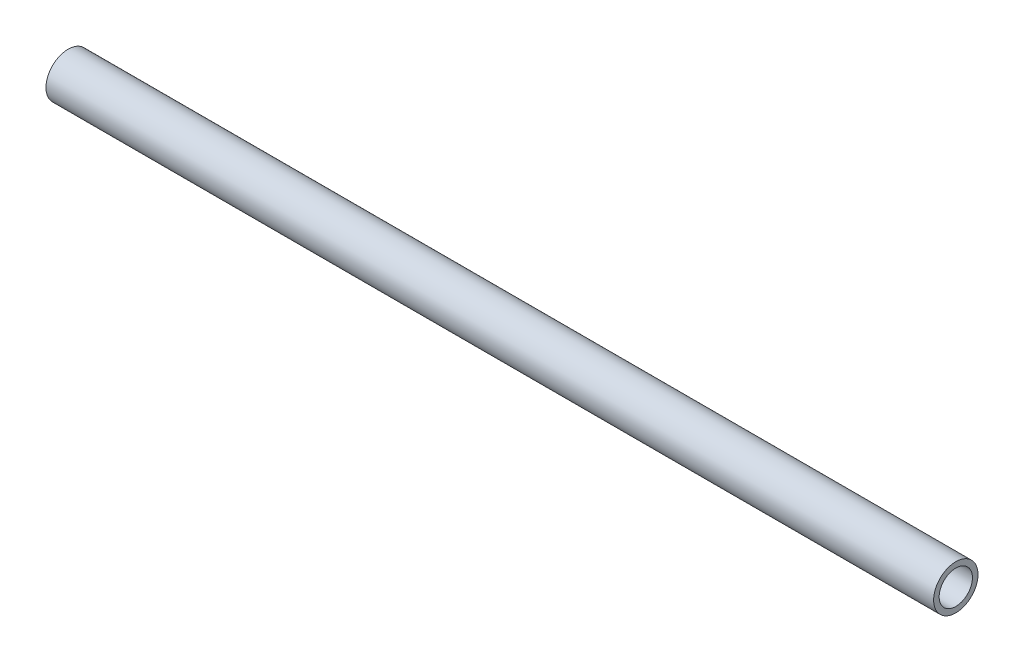
ISO-10303-21;
HEADER;
FILE_DESCRIPTION(('STEP AP214'),'2;1');
FILE_NAME('part.step','',(''),(''),'','','');
FILE_SCHEMA(('AUTOMOTIVE_DESIGN { 1 0 10303 214 1 1 1 1 }'));
ENDSEC;
DATA;
#1=APPLICATION_CONTEXT('core data for automotive mechanical design processes');
#2=APPLICATION_PROTOCOL_DEFINITION('international standard','automotive_design',2000,#1);
#3=PRODUCT_CONTEXT('',#1,'mechanical');
#4=PRODUCT('Part','Part','',(#3));
#5=PRODUCT_RELATED_PRODUCT_CATEGORY('part','',(#4));
#6=PRODUCT_DEFINITION_FORMATION('','',#4);
#7=PRODUCT_DEFINITION_CONTEXT('part definition',#1,'design');
#8=PRODUCT_DEFINITION('design','',#6,#7);
#9=PRODUCT_DEFINITION_SHAPE('','',#8);
#10=(LENGTH_UNIT() NAMED_UNIT(*) SI_UNIT(.MILLI.,.METRE.));
#11=(NAMED_UNIT(*) PLANE_ANGLE_UNIT() SI_UNIT($,.RADIAN.));
#12=(NAMED_UNIT(*) SI_UNIT($,.STERADIAN.) SOLID_ANGLE_UNIT());
#13=UNCERTAINTY_MEASURE_WITH_UNIT(LENGTH_MEASURE(1.E-05),#10,'distance_accuracy_value','');
#14=(GEOMETRIC_REPRESENTATION_CONTEXT(3) GLOBAL_UNCERTAINTY_ASSIGNED_CONTEXT((#13)) GLOBAL_UNIT_ASSIGNED_CONTEXT((#10,
#11,#12)) REPRESENTATION_CONTEXT('',''));
#15=CARTESIAN_POINT('',(0.,0.,0.));
#16=DIRECTION('',(0.,0.,1.));
#17=DIRECTION('',(1.,0.,0.));
#18=AXIS2_PLACEMENT_3D('',#15,#16,#17);
#19=CARTESIAN_POINT('',(127.,0.,0.));
#20=DIRECTION('',(1.,0.,0.));
#21=DIRECTION('',(0.,0.,-1.));
#22=AXIS2_PLACEMENT_3D('',#19,#20,#21);
#23=PLANE('',#22);
#24=CARTESIAN_POINT('',(127.,0.,0.));
#25=DIRECTION('',(1.,0.,0.));
#26=DIRECTION('',(0.,0.,-1.));
#27=AXIS2_PLACEMENT_3D('',#24,#25,#26);
#28=CIRCLE('',#27,6.35);
#29=CARTESIAN_POINT('',(127.,0.,-6.35));
#30=VERTEX_POINT('',#29);
#31=EDGE_CURVE('E10',#30,#30,#28,.T.);
#32=ORIENTED_EDGE('',*,*,#31,.T.);
#33=EDGE_LOOP('',(#32));
#34=FACE_BOUND('',#33,.T.);
#35=CARTESIAN_POINT('',(127.,0.,0.));
#36=DIRECTION('',(1.,0.,0.));
#37=DIRECTION('',(0.,0.,-1.));
#38=AXIS2_PLACEMENT_3D('',#35,#36,#37);
#39=CIRCLE('',#38,4.7625);
#40=CARTESIAN_POINT('',(127.,0.,-4.7625));
#41=VERTEX_POINT('',#40);
#42=EDGE_CURVE('E41',#41,#41,#39,.T.);
#43=ORIENTED_EDGE('',*,*,#42,.F.);
#44=EDGE_LOOP('',(#43));
#45=FACE_BOUND('',#44,.T.);
#46=ADVANCED_FACE('F30',(#34,#45),#23,.T.);
#47=CARTESIAN_POINT('',(-127.,0.,0.));
#48=DIRECTION('',(1.,0.,0.));
#49=DIRECTION('',(0.,0.,-1.));
#50=AXIS2_PLACEMENT_3D('',#47,#48,#49);
#51=PLANE('',#50);
#52=CARTESIAN_POINT('',(-127.,0.,0.));
#53=DIRECTION('',(1.,0.,0.));
#54=DIRECTION('',(0.,0.,-1.));
#55=AXIS2_PLACEMENT_3D('',#52,#53,#54);
#56=CIRCLE('',#55,6.35);
#57=CARTESIAN_POINT('',(-127.,0.,-6.35));
#58=VERTEX_POINT('',#57);
#59=EDGE_CURVE('E34',#58,#58,#56,.T.);
#60=ORIENTED_EDGE('',*,*,#59,.F.);
#61=EDGE_LOOP('',(#60));
#62=FACE_BOUND('',#61,.T.);
#63=CARTESIAN_POINT('',(-127.,0.,0.));
#64=DIRECTION('',(1.,0.,0.));
#65=DIRECTION('',(0.,0.,-1.));
#66=AXIS2_PLACEMENT_3D('',#63,#64,#65);
#67=CIRCLE('',#66,4.7625);
#68=CARTESIAN_POINT('',(-127.,0.,-4.7625));
#69=VERTEX_POINT('',#68);
#70=EDGE_CURVE('E43',#69,#69,#67,.T.);
#71=ORIENTED_EDGE('',*,*,#70,.T.);
#72=EDGE_LOOP('',(#71));
#73=FACE_BOUND('',#72,.T.);
#74=ADVANCED_FACE('F53',(#62,#73),#51,.F.);
#75=CARTESIAN_POINT('',(127.,0.,0.));
#76=DIRECTION('',(-1.,0.,0.));
#77=DIRECTION('',(0.,0.,1.));
#78=AXIS2_PLACEMENT_3D('',#75,#76,#77);
#79=CYLINDRICAL_SURFACE('',#78,6.35);
#80=ORIENTED_EDGE('',*,*,#31,.F.);
#81=EDGE_LOOP('',(#80));
#82=FACE_BOUND('',#81,.T.);
#83=ORIENTED_EDGE('',*,*,#59,.T.);
#84=EDGE_LOOP('',(#83));
#85=FACE_BOUND('',#84,.T.);
#86=ADVANCED_FACE('F32',(#82,#85),#79,.T.);
#87=CARTESIAN_POINT('',(127.,0.,0.));
#88=DIRECTION('',(-1.,0.,0.));
#89=DIRECTION('',(0.,0.,1.));
#90=AXIS2_PLACEMENT_3D('',#87,#88,#89);
#91=CYLINDRICAL_SURFACE('',#90,4.7625);
#92=ORIENTED_EDGE('',*,*,#42,.T.);
#93=EDGE_LOOP('',(#92));
#94=FACE_BOUND('',#93,.T.);
#95=ORIENTED_EDGE('',*,*,#70,.F.);
#96=EDGE_LOOP('',(#95));
#97=FACE_BOUND('',#96,.T.);
#98=ADVANCED_FACE('F49',(#94,#97),#91,.F.);
#99=CLOSED_SHELL('',(#46,#74,#86,#98));
#100=MANIFOLD_SOLID_BREP('B2',#99);
#101=ADVANCED_BREP_SHAPE_REPRESENTATION('',(#18,#100),#14);
#102=SHAPE_DEFINITION_REPRESENTATION(#9,#101);
ENDSEC;
END-ISO-10303-21;
